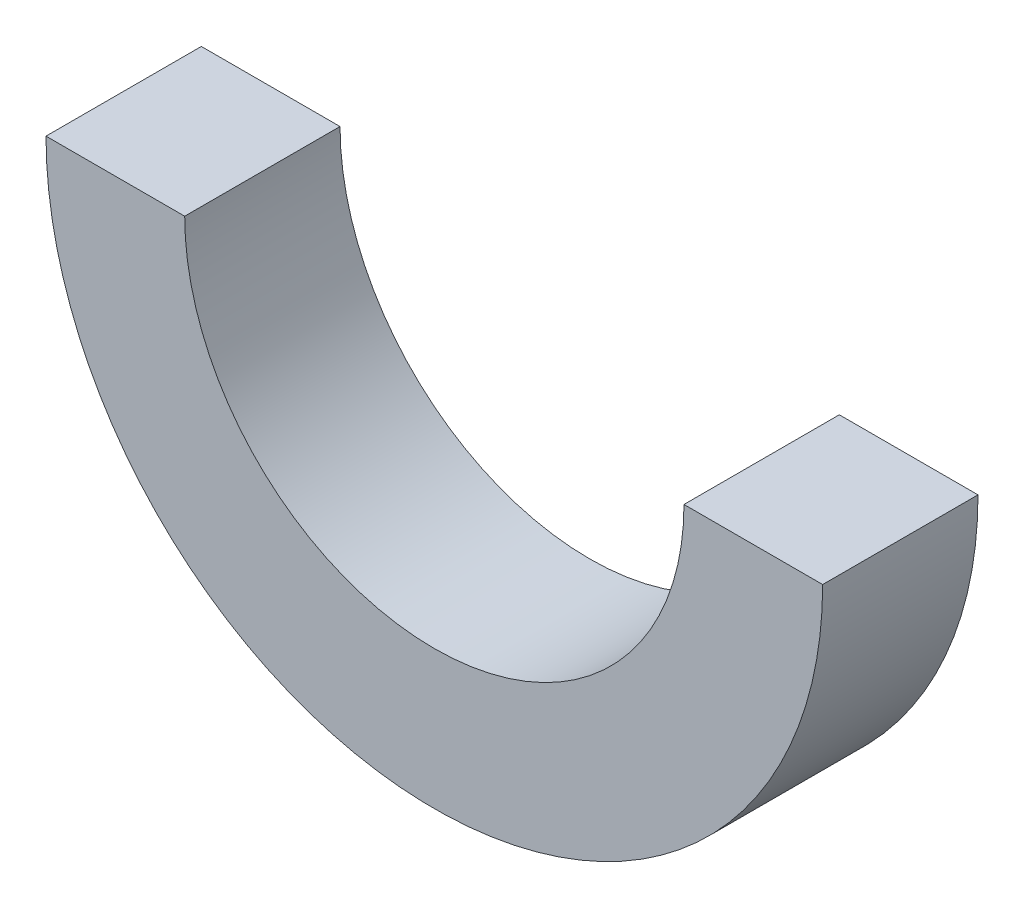
ISO-10303-21;
HEADER;
FILE_DESCRIPTION(('STEP AP214'),'2;1');
FILE_NAME('part.step','',(''),(''),'','','');
FILE_SCHEMA(('AUTOMOTIVE_DESIGN { 1 0 10303 214 1 1 1 1 }'));
ENDSEC;
DATA;
#1=APPLICATION_CONTEXT('core data for automotive mechanical design processes');
#2=APPLICATION_PROTOCOL_DEFINITION('international standard','automotive_design',2000,#1);
#3=PRODUCT_CONTEXT('',#1,'mechanical');
#4=PRODUCT('Part','Part','',(#3));
#5=PRODUCT_RELATED_PRODUCT_CATEGORY('part','',(#4));
#6=PRODUCT_DEFINITION_FORMATION('','',#4);
#7=PRODUCT_DEFINITION_CONTEXT('part definition',#1,'design');
#8=PRODUCT_DEFINITION('design','',#6,#7);
#9=PRODUCT_DEFINITION_SHAPE('','',#8);
#10=(LENGTH_UNIT() NAMED_UNIT(*) SI_UNIT(.MILLI.,.METRE.));
#11=(NAMED_UNIT(*) PLANE_ANGLE_UNIT() SI_UNIT($,.RADIAN.));
#12=(NAMED_UNIT(*) SI_UNIT($,.STERADIAN.) SOLID_ANGLE_UNIT());
#13=UNCERTAINTY_MEASURE_WITH_UNIT(LENGTH_MEASURE(1.E-05),#10,'distance_accuracy_value','');
#14=(GEOMETRIC_REPRESENTATION_CONTEXT(3) GLOBAL_UNCERTAINTY_ASSIGNED_CONTEXT((#13)) GLOBAL_UNIT_ASSIGNED_CONTEXT((#10,
#11,#12)) REPRESENTATION_CONTEXT('',''));
#15=CARTESIAN_POINT('',(0.,0.,0.));
#16=DIRECTION('',(0.,0.,1.));
#17=DIRECTION('',(1.,0.,0.));
#18=AXIS2_PLACEMENT_3D('',#15,#16,#17);
#19=CARTESIAN_POINT('',(0.,0.,7.));
#20=DIRECTION('',(0.,0.,-1.));
#21=DIRECTION('',(-1.,0.,0.));
#22=AXIS2_PLACEMENT_3D('',#19,#20,#21);
#23=CYLINDRICAL_SURFACE('',#22,11.25);
#24=CARTESIAN_POINT('',(0.,0.,0.));
#25=DIRECTION('',(0.,0.,1.));
#26=DIRECTION('',(1.,0.,0.));
#27=AXIS2_PLACEMENT_3D('',#24,#25,#26);
#28=CIRCLE('',#27,11.25);
#29=CARTESIAN_POINT('',(-11.25,0.,0.));
#30=VERTEX_POINT('',#29);
#31=CARTESIAN_POINT('',(11.25,0.,0.));
#32=VERTEX_POINT('',#31);
#33=EDGE_CURVE('E101',#30,#32,#28,.T.);
#34=ORIENTED_EDGE('',*,*,#33,.F.);
#35=DIRECTION('',(0.,0.,-1.));
#36=VECTOR('',#35,1.);
#37=CARTESIAN_POINT('',(-11.25,0.,7.));
#38=LINE('',#37,#36);
#39=CARTESIAN_POINT('',(-11.25,0.,7.));
#40=VERTEX_POINT('',#39);
#41=EDGE_CURVE('E11',#40,#30,#38,.T.);
#42=ORIENTED_EDGE('',*,*,#41,.F.);
#43=CARTESIAN_POINT('',(0.,0.,7.));
#44=DIRECTION('',(0.,0.,1.));
#45=DIRECTION('',(1.,0.,0.));
#46=AXIS2_PLACEMENT_3D('',#43,#44,#45);
#47=CIRCLE('',#46,11.25);
#48=CARTESIAN_POINT('',(11.25,0.,7.));
#49=VERTEX_POINT('',#48);
#50=EDGE_CURVE('E91',#40,#49,#47,.T.);
#51=ORIENTED_EDGE('',*,*,#50,.T.);
#52=DIRECTION('',(0.,0.,-1.));
#53=VECTOR('',#52,1.);
#54=CARTESIAN_POINT('',(11.25,0.,7.));
#55=LINE('',#54,#53);
#56=EDGE_CURVE('E49',#49,#32,#55,.T.);
#57=ORIENTED_EDGE('',*,*,#56,.T.);
#58=EDGE_LOOP('',(#34,#42,#51,#57));
#59=FACE_BOUND('',#58,.T.);
#60=ADVANCED_FACE('F33',(#59),#23,.F.);
#61=CARTESIAN_POINT('',(0.,0.,7.));
#62=DIRECTION('',(0.,1.,0.));
#63=DIRECTION('',(0.,0.,1.));
#64=AXIS2_PLACEMENT_3D('',#61,#62,#63);
#65=PLANE('',#64);
#66=DIRECTION('',(1.,0.,0.));
#67=VECTOR('',#66,1.);
#68=CARTESIAN_POINT('',(0.,0.,0.));
#69=LINE('',#68,#67);
#70=CARTESIAN_POINT('',(-17.5,0.,0.));
#71=VERTEX_POINT('',#70);
#72=EDGE_CURVE('E81',#71,#30,#69,.T.);
#73=ORIENTED_EDGE('',*,*,#72,.F.);
#74=DIRECTION('',(0.,0.,-1.));
#75=VECTOR('',#74,1.);
#76=CARTESIAN_POINT('',(-17.5,0.,7.));
#77=LINE('',#76,#75);
#78=CARTESIAN_POINT('',(-17.5,0.,7.));
#79=VERTEX_POINT('',#78);
#80=EDGE_CURVE('E41',#79,#71,#77,.T.);
#81=ORIENTED_EDGE('',*,*,#80,.F.);
#82=DIRECTION('',(1.,0.,0.));
#83=VECTOR('',#82,1.);
#84=CARTESIAN_POINT('',(0.,0.,7.));
#85=LINE('',#84,#83);
#86=EDGE_CURVE('E79',#79,#40,#85,.T.);
#87=ORIENTED_EDGE('',*,*,#86,.T.);
#88=ORIENTED_EDGE('',*,*,#41,.T.);
#89=EDGE_LOOP('',(#73,#81,#87,#88));
#90=FACE_BOUND('',#89,.T.);
#91=ADVANCED_FACE('F77',(#90),#65,.T.);
#92=CARTESIAN_POINT('',(0.,0.,7.));
#93=DIRECTION('',(0.,0.,-1.));
#94=DIRECTION('',(-1.,0.,0.));
#95=AXIS2_PLACEMENT_3D('',#92,#93,#94);
#96=CYLINDRICAL_SURFACE('',#95,17.5);
#97=CARTESIAN_POINT('',(0.,0.,0.));
#98=DIRECTION('',(0.,0.,1.));
#99=DIRECTION('',(1.,0.,0.));
#100=AXIS2_PLACEMENT_3D('',#97,#98,#99);
#101=CIRCLE('',#100,17.5);
#102=CARTESIAN_POINT('',(17.5,0.,0.));
#103=VERTEX_POINT('',#102);
#104=EDGE_CURVE('E98',#71,#103,#101,.T.);
#105=ORIENTED_EDGE('',*,*,#104,.T.);
#106=DIRECTION('',(0.,0.,-1.));
#107=VECTOR('',#106,1.);
#108=CARTESIAN_POINT('',(17.5,0.,7.));
#109=LINE('',#108,#107);
#110=CARTESIAN_POINT('',(17.5,0.,7.));
#111=VERTEX_POINT('',#110);
#112=EDGE_CURVE('E63',#111,#103,#109,.T.);
#113=ORIENTED_EDGE('',*,*,#112,.F.);
#114=CARTESIAN_POINT('',(0.,0.,7.));
#115=DIRECTION('',(0.,0.,1.));
#116=DIRECTION('',(1.,0.,0.));
#117=AXIS2_PLACEMENT_3D('',#114,#115,#116);
#118=CIRCLE('',#117,17.5);
#119=EDGE_CURVE('E84',#79,#111,#118,.T.);
#120=ORIENTED_EDGE('',*,*,#119,.F.);
#121=ORIENTED_EDGE('',*,*,#80,.T.);
#122=EDGE_LOOP('',(#105,#113,#120,#121));
#123=FACE_BOUND('',#122,.T.);
#124=ADVANCED_FACE('F85',(#123),#96,.T.);
#125=EDGE_CURVE('E93',#32,#103,#69,.T.);
#126=ORIENTED_EDGE('',*,*,#125,.F.);
#127=ORIENTED_EDGE('',*,*,#56,.F.);
#128=EDGE_CURVE('E88',#49,#111,#85,.T.);
#129=ORIENTED_EDGE('',*,*,#128,.T.);
#130=ORIENTED_EDGE('',*,*,#112,.T.);
#131=EDGE_LOOP('',(#126,#127,#129,#130));
#132=FACE_BOUND('',#131,.T.);
#133=ADVANCED_FACE('F105',(#132),#65,.T.);
#134=CARTESIAN_POINT('',(0.,0.,7.));
#135=DIRECTION('',(0.,0.,1.));
#136=DIRECTION('',(1.,0.,0.));
#137=AXIS2_PLACEMENT_3D('',#134,#135,#136);
#138=PLANE('',#137);
#139=ORIENTED_EDGE('',*,*,#50,.F.);
#140=ORIENTED_EDGE('',*,*,#86,.F.);
#141=ORIENTED_EDGE('',*,*,#119,.T.);
#142=ORIENTED_EDGE('',*,*,#128,.F.);
#143=EDGE_LOOP('',(#139,#140,#141,#142));
#144=FACE_BOUND('',#143,.T.);
#145=ADVANCED_FACE('F90',(#144),#138,.T.);
#146=CARTESIAN_POINT('',(0.,0.,0.));
#147=DIRECTION('',(0.,0.,1.));
#148=DIRECTION('',(1.,0.,0.));
#149=AXIS2_PLACEMENT_3D('',#146,#147,#148);
#150=PLANE('',#149);
#151=ORIENTED_EDGE('',*,*,#33,.T.);
#152=ORIENTED_EDGE('',*,*,#125,.T.);
#153=ORIENTED_EDGE('',*,*,#104,.F.);
#154=ORIENTED_EDGE('',*,*,#72,.T.);
#155=EDGE_LOOP('',(#151,#152,#153,#154));
#156=FACE_BOUND('',#155,.T.);
#157=ADVANCED_FACE('F104',(#156),#150,.F.);
#158=CLOSED_SHELL('',(#60,#91,#124,#133,#145,#157));
#159=MANIFOLD_SOLID_BREP('B2',#158);
#160=ADVANCED_BREP_SHAPE_REPRESENTATION('',(#18,#159),#14);
#161=SHAPE_DEFINITION_REPRESENTATION(#9,#160);
ENDSEC;
END-ISO-10303-21;
